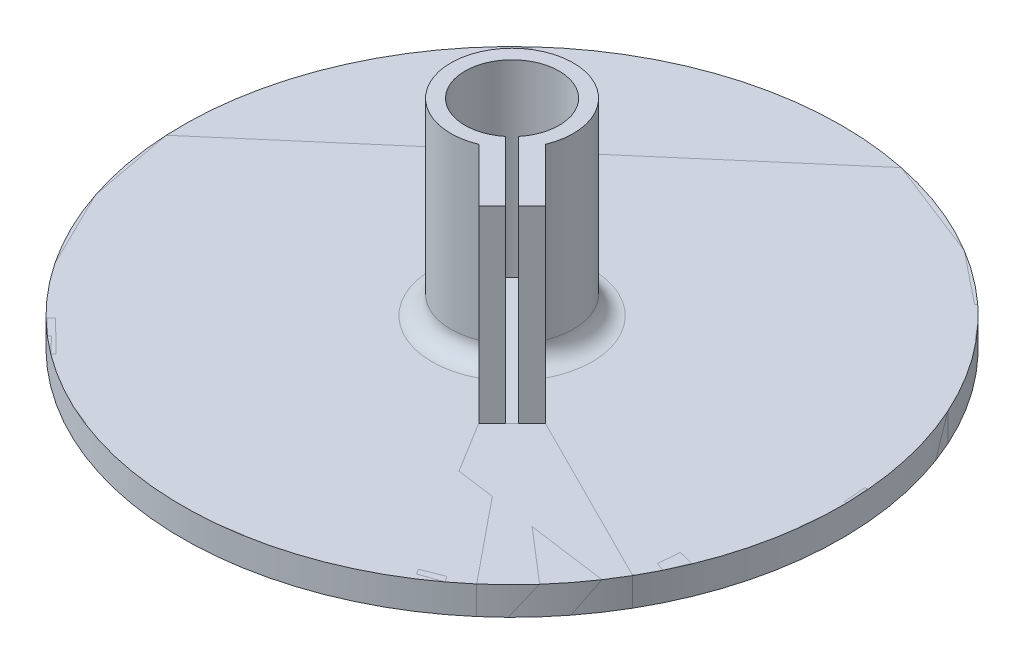
ISO-10303-21;
HEADER;
FILE_DESCRIPTION(('STEP AP214'),'2;1');
FILE_NAME('part.step','',(''),(''),'','','');
FILE_SCHEMA(('AUTOMOTIVE_DESIGN { 1 0 10303 214 1 1 1 1 }'));
ENDSEC;
DATA;
#1=APPLICATION_CONTEXT('core data for automotive mechanical design processes');
#2=APPLICATION_PROTOCOL_DEFINITION('international standard','automotive_design',2000,#1);
#3=PRODUCT_CONTEXT('',#1,'mechanical');
#4=PRODUCT('Part','Part','',(#3));
#5=PRODUCT_RELATED_PRODUCT_CATEGORY('part','',(#4));
#6=PRODUCT_DEFINITION_FORMATION('','',#4);
#7=PRODUCT_DEFINITION_CONTEXT('part definition',#1,'design');
#8=PRODUCT_DEFINITION('design','',#6,#7);
#9=PRODUCT_DEFINITION_SHAPE('','',#8);
#10=(LENGTH_UNIT() NAMED_UNIT(*) SI_UNIT(.MILLI.,.METRE.));
#11=(NAMED_UNIT(*) PLANE_ANGLE_UNIT() SI_UNIT($,.RADIAN.));
#12=(NAMED_UNIT(*) SI_UNIT($,.STERADIAN.) SOLID_ANGLE_UNIT());
#13=UNCERTAINTY_MEASURE_WITH_UNIT(LENGTH_MEASURE(1.E-05),#10,'distance_accuracy_value','');
#14=(GEOMETRIC_REPRESENTATION_CONTEXT(3) GLOBAL_UNCERTAINTY_ASSIGNED_CONTEXT((#13)) GLOBAL_UNIT_ASSIGNED_CONTEXT((#10,
#11,#12)) REPRESENTATION_CONTEXT('',''));
#15=CARTESIAN_POINT('',(0.,0.,0.));
#16=DIRECTION('',(0.,0.,1.));
#17=DIRECTION('',(1.,0.,0.));
#18=AXIS2_PLACEMENT_3D('',#15,#16,#17);
#19=CARTESIAN_POINT('',(4.9497474683059,11.5,4.94974746830577));
#20=DIRECTION('',(-0.707106781186557,0.,-0.707106781186538));
#21=DIRECTION('',(-0.707106781186538,0.,0.707106781186557));
#22=AXIS2_PLACEMENT_3D('',#19,#20,#21);
#23=PLANE('',#22);
#24=DIRECTION('',(0.,1.,0.));
#25=VECTOR('',#24,1.);
#26=CARTESIAN_POINT('',(5.12652416360251,11.5,4.77297077300915));
#27=LINE('',#26,#25);
#28=CARTESIAN_POINT('',(5.12652416360252,1.5,4.77297077300914));
#29=VERTEX_POINT('',#28);
#30=CARTESIAN_POINT('',(5.12652416360251,11.5,4.77297077300915));
#31=VERTEX_POINT('',#30);
#32=EDGE_CURVE('P0_E139',#29,#31,#27,.T.);
#33=ORIENTED_EDGE('',*,*,#32,.F.);
#34=DIRECTION('',(-0.707106781186538,0.,0.707106781186557));
#35=VECTOR('',#34,1.);
#36=CARTESIAN_POINT('',(4.9497474683059,1.5,4.94974746830577));
#37=LINE('',#36,#35);
#38=CARTESIAN_POINT('',(5.83363094478907,1.5,4.06586399182257));
#39=VERTEX_POINT('',#38);
#40=EDGE_CURVE('P0_E142',#39,#29,#37,.T.);
#41=ORIENTED_EDGE('',*,*,#40,.F.);
#42=DIRECTION('',(0.,1.,0.));
#43=VECTOR('',#42,1.);
#44=CARTESIAN_POINT('',(5.83363094478907,11.5,4.06586399182257));
#45=LINE('',#44,#43);
#46=CARTESIAN_POINT('',(5.83363094478907,11.5,4.06586399182257));
#47=VERTEX_POINT('',#46);
#48=EDGE_CURVE('P0_E136',#39,#47,#45,.T.);
#49=ORIENTED_EDGE('',*,*,#48,.T.);
#50=DIRECTION('',(0.707106781186537,0.,-0.707106781186558));
#51=VECTOR('',#50,1.);
#52=CARTESIAN_POINT('',(5.12652416360251,11.5,4.77297077300915));
#53=LINE('',#52,#51);
#54=EDGE_CURVE('P0_E121',#31,#47,#53,.T.);
#55=ORIENTED_EDGE('',*,*,#54,.F.);
#56=EDGE_LOOP('',(#33,#41,#49,#55));
#57=FACE_BOUND('',#56,.T.);
#58=ADVANCED_FACE('P0_F43',(#57),#23,.F.);
#59=CARTESIAN_POINT('',(4.94974746830591,11.5,4.94974746830576));
#60=DIRECTION('',(0.707106781186558,0.,0.707106781186537));
#61=DIRECTION('',(0.707106781186537,0.,-0.707106781186558));
#62=AXIS2_PLACEMENT_3D('',#59,#60,#61);
#63=PLANE('',#62);
#64=DIRECTION('',(0.707106781186536,0.,-0.707106781186559));
#65=VECTOR('',#64,1.);
#66=CARTESIAN_POINT('',(4.06586399182272,11.5,5.83363094478897));
#67=LINE('',#66,#65);
#68=CARTESIAN_POINT('',(4.06586399182273,11.5,5.83363094478897));
#69=VERTEX_POINT('',#68);
#70=CARTESIAN_POINT('',(4.77297077300926,11.5,5.12652416360241));
#71=VERTEX_POINT('',#70);
#72=EDGE_CURVE('P0_E132',#69,#71,#67,.T.);
#73=ORIENTED_EDGE('',*,*,#72,.F.);
#74=DIRECTION('',(0.,1.,0.));
#75=VECTOR('',#74,1.);
#76=CARTESIAN_POINT('',(4.06586399182272,11.5,5.83363094478897));
#77=LINE('',#76,#75);
#78=CARTESIAN_POINT('',(4.06586399182272,1.5,5.83363094478897));
#79=VERTEX_POINT('',#78);
#80=EDGE_CURVE('P0_E185',#79,#69,#77,.T.);
#81=ORIENTED_EDGE('',*,*,#80,.F.);
#82=DIRECTION('',(0.707106781186537,0.,-0.707106781186558));
#83=VECTOR('',#82,1.);
#84=CARTESIAN_POINT('',(4.94974746830591,1.49999999999999,4.94974746830576));
#85=LINE('',#84,#83);
#86=CARTESIAN_POINT('',(4.77297077300926,1.5,5.12652416360241));
#87=VERTEX_POINT('',#86);
#88=EDGE_CURVE('P0_E292',#79,#87,#85,.T.);
#89=ORIENTED_EDGE('',*,*,#88,.T.);
#90=DIRECTION('',(0.,1.,0.));
#91=VECTOR('',#90,1.);
#92=CARTESIAN_POINT('',(4.77297077300926,11.5,5.12652416360241));
#93=LINE('',#92,#91);
#94=EDGE_CURVE('P0_E174',#87,#71,#93,.T.);
#95=ORIENTED_EDGE('',*,*,#94,.T.);
#96=EDGE_LOOP('',(#73,#81,#89,#95));
#97=FACE_BOUND('',#96,.T.);
#98=ADVANCED_FACE('P0_F223',(#97),#63,.T.);
#99=CARTESIAN_POINT('',(0.,11.5,0.));
#100=DIRECTION('',(0.,1.,0.));
#101=DIRECTION('',(0.,0.,1.));
#102=AXIS2_PLACEMENT_3D('',#99,#100,#101);
#103=PLANE('',#102);
#104=CARTESIAN_POINT('',(0.,11.5,0.));
#105=DIRECTION('',(0.,-1.,0.));
#106=DIRECTION('',(0.,0.,-1.));
#107=AXIS2_PLACEMENT_3D('',#104,#105,#106);
#108=CIRCLE('',#107,3.25);
#109=CARTESIAN_POINT('',(1.2374368670765,11.5,3.00520382004281));
#110=VERTEX_POINT('',#109);
#111=CARTESIAN_POINT('',(3.00520382004285,11.5,1.23743686707642));
#112=VERTEX_POINT('',#111);
#113=EDGE_CURVE('P0_E131',#110,#112,#108,.T.);
#114=ORIENTED_EDGE('',*,*,#113,.F.);
#115=DIRECTION('',(0.707106781186557,0.,0.707106781186538));
#116=VECTOR('',#115,1.);
#117=CARTESIAN_POINT('',(-0.883883476483175,11.5,0.883883476483198));
#118=LINE('',#117,#116);
#119=EDGE_CURVE('P0_E152',#69,#110,#118,.F.);
#120=ORIENTED_EDGE('',*,*,#119,.F.);
#121=ORIENTED_EDGE('',*,*,#72,.T.);
#122=DIRECTION('',(0.707106781186557,0.,0.707106781186538));
#123=VECTOR('',#122,1.);
#124=CARTESIAN_POINT('',(-0.176776695296636,11.5,0.176776695296641));
#125=LINE('',#124,#123);
#126=CARTESIAN_POINT('',(1.58212921463717,11.5,1.9356826052304));
#127=VERTEX_POINT('',#126);
#128=EDGE_CURVE('P0_E178',#71,#127,#125,.F.);
#129=ORIENTED_EDGE('',*,*,#128,.T.);
#130=CARTESIAN_POINT('',(0.,11.5,0.));
#131=DIRECTION('',(0.,-1.,0.));
#132=DIRECTION('',(0.,0.,-1.));
#133=AXIS2_PLACEMENT_3D('',#130,#131,#132);
#134=CIRCLE('',#133,2.5);
#135=CARTESIAN_POINT('',(1.93568260523045,11.5,1.58212921463712));
#136=VERTEX_POINT('',#135);
#137=EDGE_CURVE('P0_E171',#127,#136,#134,.T.);
#138=ORIENTED_EDGE('',*,*,#137,.T.);
#139=DIRECTION('',(0.707106781186551,0.,0.707106781186544));
#140=VECTOR('',#139,1.);
#141=CARTESIAN_POINT('',(0.176776695296654,11.5,-0.176776695296656));
#142=LINE('',#141,#140);
#143=EDGE_CURVE('P0_E126',#31,#136,#142,.F.);
#144=ORIENTED_EDGE('',*,*,#143,.F.);
#145=ORIENTED_EDGE('',*,*,#54,.T.);
#146=DIRECTION('',(0.707106781186556,0.,0.707106781186539));
#147=VECTOR('',#146,1.);
#148=CARTESIAN_POINT('',(0.883883476483177,11.5,-0.883883476483198));
#149=LINE('',#148,#147);
#150=EDGE_CURVE('P0_E124',#47,#112,#149,.F.);
#151=ORIENTED_EDGE('',*,*,#150,.T.);
#152=EDGE_LOOP('',(#114,#120,#121,#129,#138,#144,#145,#151));
#153=FACE_BOUND('',#152,.T.);
#154=ADVANCED_FACE('P0_F123',(#153),#103,.T.);
#155=CARTESIAN_POINT('',(0.,11.5,0.));
#156=DIRECTION('',(0.,-1.,0.));
#157=DIRECTION('',(0.,0.,-1.));
#158=AXIS2_PLACEMENT_3D('',#155,#156,#157);
#159=CYLINDRICAL_SURFACE('',#158,3.25);
#160=DIRECTION('',(0.,1.,0.));
#161=VECTOR('',#160,1.);
#162=CARTESIAN_POINT('',(3.00520382004284,11.5,1.23743686707642));
#163=LINE('',#162,#161);
#164=CARTESIAN_POINT('',(3.00520382004284,2.5,1.23743686707642));
#165=VERTEX_POINT('',#164);
#166=EDGE_CURVE('P0_E137',#112,#165,#163,.F.);
#167=ORIENTED_EDGE('',*,*,#166,.T.);
#168=CARTESIAN_POINT('',(0.,2.5,0.));
#169=DIRECTION('',(0.,1.,0.));
#170=DIRECTION('',(0.,0.,1.));
#171=AXIS2_PLACEMENT_3D('',#168,#169,#170);
#172=CIRCLE('',#171,3.25);
#173=CARTESIAN_POINT('',(1.2374368670765,2.5,3.00520382004281));
#174=VERTEX_POINT('',#173);
#175=EDGE_CURVE('P0_E57',#165,#174,#172,.T.);
#176=ORIENTED_EDGE('',*,*,#175,.T.);
#177=DIRECTION('',(0.,1.,0.));
#178=VECTOR('',#177,1.);
#179=CARTESIAN_POINT('',(1.2374368670765,11.5,3.00520382004281));
#180=LINE('',#179,#178);
#181=EDGE_CURVE('P0_E188',#110,#174,#180,.F.);
#182=ORIENTED_EDGE('',*,*,#181,.F.);
#183=ORIENTED_EDGE('',*,*,#113,.T.);
#184=EDGE_LOOP('',(#167,#176,#182,#183));
#185=FACE_BOUND('',#184,.T.);
#186=ADVANCED_FACE('P0_F216',(#185),#159,.T.);
#187=CARTESIAN_POINT('',(0.883883476483177,11.5,-0.883883476483198));
#188=DIRECTION('',(-0.707106781186539,0.,0.707106781186556));
#189=DIRECTION('',(0.707106781186556,0.,0.707106781186539));
#190=AXIS2_PLACEMENT_3D('',#187,#188,#189);
#191=PLANE('',#190);
#192=CARTESIAN_POINT('',(4.37547034870921,6.30693793995764,2.60770339574275));
#193=DIRECTION('',(-0.707106781186539,0.,0.707106781186556));
#194=DIRECTION('',(0.707106781186556,0.,0.707106781186539));
#195=AXIS2_PLACEMENT_3D('',#192,#193,#194);
#196=CIRCLE('',#195,0.999999999999999);
#197=CARTESIAN_POINT('',(5.08257712989577,6.30693793995764,3.31481017692929));
#198=VERTEX_POINT('',#197);
#199=EDGE_CURVE('P0_E293',#198,#198,#196,.T.);
#200=ORIENTED_EDGE('',*,*,#199,.T.);
#201=EDGE_LOOP('',(#200));
#202=FACE_BOUND('',#201,.T.);
#203=DIRECTION('',(0.707106781186556,0.,0.707106781186539));
#204=VECTOR('',#203,1.);
#205=CARTESIAN_POINT('',(3.00520382004284,1.5,1.23743686707642));
#206=LINE('',#205,#204);
#207=CARTESIAN_POINT('',(3.75616479975223,1.5,1.98839784678578));
#208=VERTEX_POINT('',#207);
#209=EDGE_CURVE('P0_E191',#208,#39,#206,.T.);
#210=ORIENTED_EDGE('',*,*,#209,.F.);
#211=CARTESIAN_POINT('',(3.75616479975223,1.5,1.98839784678578));
#212=CARTESIAN_POINT('',(3.71235481496573,1.49996434340354,1.94458786199929));
#213=CARTESIAN_POINT('',(3.66856007215664,1.50525791034755,1.9007931191902));
#214=CARTESIAN_POINT('',(3.58220986541938,1.52610742433583,1.81444291245294));
#215=CARTESIAN_POINT('',(3.53965433452256,1.5416628157389,1.77188738155612));
#216=CARTESIAN_POINT('',(3.45697142020611,1.5826473896517,1.68920446723968));
#217=CARTESIAN_POINT('',(3.41684491886813,1.60808013447064,1.64907796590169));
#218=CARTESIAN_POINT('',(3.34021721265806,1.66818742125207,1.57245025969163));
#219=CARTESIAN_POINT('',(3.30371531986759,1.70286020491827,1.53594836690116));
#220=CARTESIAN_POINT('',(3.23583345910834,1.78026052414193,1.46806650614191));
#221=CARTESIAN_POINT('',(3.20440748961424,1.82290715367659,1.43664053664781));
#222=CARTESIAN_POINT('',(3.14739787541136,1.91544003750141,1.37963092244493));
#223=CARTESIAN_POINT('',(3.12181400853563,1.96532601637126,1.3540470555692));
#224=CARTESIAN_POINT('',(3.07877173768836,2.06813016401641,1.31100478472194));
#225=CARTESIAN_POINT('',(3.06095505300264,2.12074827043324,1.29318810003621));
#226=CARTESIAN_POINT('',(3.03239844974008,2.22965373572821,1.26463149677365));
#227=CARTESIAN_POINT('',(3.02164590251538,2.28593434797145,1.25387894954896));
#228=CARTESIAN_POINT('',(3.0115366843966,2.36899565685474,1.24376973143017));
#229=CARTESIAN_POINT('',(3.00916343219829,2.39509956733447,1.24139647923186));
#230=CARTESIAN_POINT('',(3.00599795119211,2.44746404296182,1.23823099822568));
#231=CARTESIAN_POINT('',(3.00520366570885,2.47372435957889,1.23743671274242));
#232=CARTESIAN_POINT('',(3.00520382004286,2.5,1.23743686707643));
#233=B_SPLINE_CURVE_WITH_KNOTS('',3,(#211,#212,#213,#214,#215,#216,#217,#218,#219,#220,#221,
#222,#223,#224,#225,#226,#227,#228,#229,#230,#231,#232),.UNSPECIFIED.,.F.,.F.,(4,2,2,2,2,2,2,2,
2,2,4),(0.,0.185615987238133,0.371221924857289,0.556894864296959,0.742532497043705,
0.926379815069965,1.11022014047648,1.28433402762256,1.4581357959966,1.53701141278667,
1.61578422303188),.UNSPECIFIED.);
#234=EDGE_CURVE('P0_E71',#208,#165,#233,.T.);
#235=ORIENTED_EDGE('',*,*,#234,.T.);
#236=ORIENTED_EDGE('',*,*,#166,.F.);
#237=ORIENTED_EDGE('',*,*,#150,.F.);
#238=ORIENTED_EDGE('',*,*,#48,.F.);
#239=EDGE_LOOP('',(#210,#235,#236,#237,#238));
#240=FACE_BOUND('',#239,.T.);
#241=ADVANCED_FACE('P0_F135',(#202,#240),#191,.F.);
#242=CARTESIAN_POINT('',(0.176776695296654,11.5,-0.176776695296656));
#243=DIRECTION('',(-0.707106781186544,0.,0.707106781186551));
#244=DIRECTION('',(0.707106781186551,0.,0.707106781186544));
#245=AXIS2_PLACEMENT_3D('',#242,#243,#244);
#246=PLANE('',#245);
#247=CARTESIAN_POINT('',(3.66836356752267,6.30693793995764,3.31481017692932));
#248=DIRECTION('',(-0.707106781186544,0.,0.707106781186551));
#249=DIRECTION('',(0.707106781186551,0.,0.707106781186544));
#250=AXIS2_PLACEMENT_3D('',#247,#248,#249);
#251=CIRCLE('',#250,0.999999999999999);
#252=CARTESIAN_POINT('',(4.37547034870922,6.30693793995764,4.02191695811586));
#253=VERTEX_POINT('',#252);
#254=EDGE_CURVE('P0_E467',#253,#253,#251,.T.);
#255=ORIENTED_EDGE('',*,*,#254,.F.);
#256=EDGE_LOOP('',(#255));
#257=FACE_BOUND('',#256,.T.);
#258=ORIENTED_EDGE('',*,*,#143,.T.);
#259=DIRECTION('',(0.,-1.,0.));
#260=VECTOR('',#259,1.);
#261=CARTESIAN_POINT('',(1.93568260523045,11.5,1.58212921463712));
#262=LINE('',#261,#260);
#263=CARTESIAN_POINT('',(1.93568260523045,1.5,1.58212921463712));
#264=VERTEX_POINT('',#263);
#265=EDGE_CURVE('P0_E167',#136,#264,#262,.T.);
#266=ORIENTED_EDGE('',*,*,#265,.T.);
#267=DIRECTION('',(-0.707106781186553,0.,-0.707106781186542));
#268=VECTOR('',#267,1.);
#269=CARTESIAN_POINT('',(5.12652416360252,1.5,4.77297077300914));
#270=LINE('',#269,#268);
#271=EDGE_CURVE('P0_E199',#29,#264,#270,.T.);
#272=ORIENTED_EDGE('',*,*,#271,.F.);
#273=ORIENTED_EDGE('',*,*,#32,.T.);
#274=EDGE_LOOP('',(#258,#266,#272,#273));
#275=FACE_BOUND('',#274,.T.);
#276=ADVANCED_FACE('P0_F215',(#257,#275),#246,.T.);
#277=CARTESIAN_POINT('',(0.,11.5,0.));
#278=DIRECTION('',(0.,-1.,0.));
#279=DIRECTION('',(0.,0.,-1.));
#280=AXIS2_PLACEMENT_3D('',#277,#278,#279);
#281=CYLINDRICAL_SURFACE('',#280,2.5);
#282=ORIENTED_EDGE('',*,*,#137,.F.);
#283=DIRECTION('',(0.,1.,0.));
#284=VECTOR('',#283,1.);
#285=CARTESIAN_POINT('',(1.58212921463717,11.5,1.9356826052304));
#286=LINE('',#285,#284);
#287=CARTESIAN_POINT('',(1.58212921463717,1.5,1.9356826052304));
#288=VERTEX_POINT('',#287);
#289=EDGE_CURVE('P0_E179',#127,#288,#286,.F.);
#290=ORIENTED_EDGE('',*,*,#289,.T.);
#291=CARTESIAN_POINT('',(0.,1.5,0.));
#292=DIRECTION('',(0.,-1.,0.));
#293=DIRECTION('',(0.,0.,-1.));
#294=AXIS2_PLACEMENT_3D('',#291,#292,#293);
#295=CIRCLE('',#294,2.5);
#296=EDGE_CURVE('P0_E307',#264,#288,#295,.F.);
#297=ORIENTED_EDGE('',*,*,#296,.F.);
#298=ORIENTED_EDGE('',*,*,#265,.F.);
#299=EDGE_LOOP('',(#282,#290,#297,#298));
#300=FACE_BOUND('',#299,.T.);
#301=ADVANCED_FACE('P0_F256',(#300),#281,.F.);
#302=CARTESIAN_POINT('',(-0.176776695296636,11.5,0.176776695296641));
#303=DIRECTION('',(-0.707106781186538,0.,0.707106781186557));
#304=DIRECTION('',(0.707106781186557,0.,0.707106781186538));
#305=AXIS2_PLACEMENT_3D('',#302,#303,#304);
#306=PLANE('',#305);
#307=CARTESIAN_POINT('',(3.3148101769294,6.30693793995764,3.66836356752259));
#308=DIRECTION('',(-0.707106781186538,0.,0.707106781186557));
#309=DIRECTION('',(0.707106781186557,0.,0.707106781186538));
#310=AXIS2_PLACEMENT_3D('',#307,#308,#309);
#311=CIRCLE('',#310,0.999999999999999);
#312=CARTESIAN_POINT('',(4.02191695811596,6.30693793995764,4.37547034870913));
#313=VERTEX_POINT('',#312);
#314=EDGE_CURVE('P0_E471',#313,#313,#311,.T.);
#315=ORIENTED_EDGE('',*,*,#314,.T.);
#316=EDGE_LOOP('',(#315));
#317=FACE_BOUND('',#316,.T.);
#318=ORIENTED_EDGE('',*,*,#94,.F.);
#319=DIRECTION('',(0.707106781186557,0.,0.707106781186538));
#320=VECTOR('',#319,1.);
#321=CARTESIAN_POINT('',(1.58212921463717,1.5,1.9356826052304));
#322=LINE('',#321,#320);
#323=EDGE_CURVE('P0_E273',#288,#87,#322,.T.);
#324=ORIENTED_EDGE('',*,*,#323,.F.);
#325=ORIENTED_EDGE('',*,*,#289,.F.);
#326=ORIENTED_EDGE('',*,*,#128,.F.);
#327=EDGE_LOOP('',(#318,#324,#325,#326));
#328=FACE_BOUND('',#327,.T.);
#329=ADVANCED_FACE('P0_F253',(#317,#328),#306,.F.);
#330=CARTESIAN_POINT('',(-0.883883476483175,11.5,0.883883476483198));
#331=DIRECTION('',(-0.707106781186538,0.,0.707106781186557));
#332=DIRECTION('',(0.707106781186557,0.,0.707106781186538));
#333=AXIS2_PLACEMENT_3D('',#330,#331,#332);
#334=PLANE('',#333);
#335=CARTESIAN_POINT('',(2.60770339574286,6.30693793995764,4.37547034870915));
#336=DIRECTION('',(-0.707106781186538,0.,0.707106781186557));
#337=DIRECTION('',(0.707106781186557,0.,0.707106781186538));
#338=AXIS2_PLACEMENT_3D('',#335,#336,#337);
#339=CIRCLE('',#338,0.999999999999999);
#340=CARTESIAN_POINT('',(3.31481017692942,6.30693793995764,5.08257712989568));
#341=VERTEX_POINT('',#340);
#342=EDGE_CURVE('P0_E480',#341,#341,#339,.T.);
#343=ORIENTED_EDGE('',*,*,#342,.F.);
#344=EDGE_LOOP('',(#343));
#345=FACE_BOUND('',#344,.T.);
#346=ORIENTED_EDGE('',*,*,#181,.T.);
#347=CARTESIAN_POINT('',(1.2374368670765,2.5,3.00520382004281));
#348=CARTESIAN_POINT('',(1.23743592225773,2.47328658773908,3.00520287522404));
#349=CARTESIAN_POINT('',(1.2382574214273,2.44658675258182,3.00602437439362));
#350=CARTESIAN_POINT('',(1.24152756927432,2.39339372650545,3.00929452224064));
#351=CARTESIAN_POINT('',(1.24397581024609,2.36690048549107,3.01174276321241));
#352=CARTESIAN_POINT('',(1.25370857195432,2.28819072583843,3.02147552492064));
#353=CARTESIAN_POINT('',(1.26338145692694,2.23652710367601,3.03114840989325));
#354=CARTESIAN_POINT('',(1.28867447025181,2.136273956589,3.05644142321813));
#355=CARTESIAN_POINT('',(1.30429168580219,2.08768293962392,3.0720586387685));
#356=CARTESIAN_POINT('',(1.34087094348211,1.99468393538098,3.10863789644842));
#357=CARTESIAN_POINT('',(1.3618360008399,1.95027832733394,3.12960295380622));
#358=CARTESIAN_POINT('',(1.40927501030763,1.8650708055186,3.17704196327394));
#359=CARTESIAN_POINT('',(1.43592620788518,1.82446672948126,3.20369316085149));
#360=CARTESIAN_POINT('',(1.49339116596947,1.74965413816192,3.26115811893578));
#361=CARTESIAN_POINT('',(1.52420623282895,1.71544763808739,3.29197318579526));
#362=CARTESIAN_POINT('',(1.59141623347916,1.6519615565192,3.35918318644547));
#363=CARTESIAN_POINT('',(1.62804976021061,1.62318692924783,3.39581671317692));
#364=CARTESIAN_POINT('',(1.70410525335884,1.5743257738979,3.47187220632514));
#365=CARTESIAN_POINT('',(1.74352709542095,1.55423885864442,3.51129404838725));
#366=CARTESIAN_POINT('',(1.8171298103882,1.52590928168508,3.5848967633545));
#367=CARTESIAN_POINT('',(1.85103588387719,1.51621779675563,3.61880283684349));
#368=CARTESIAN_POINT('',(1.91942301797947,1.5032606001753,3.68718997094577));
#369=CARTESIAN_POINT('',(1.95390350430202,1.49998881831728,3.72167045726832));
#370=CARTESIAN_POINT('',(1.98839784678588,1.5,3.75616479975218));
#371=B_SPLINE_CURVE_WITH_KNOTS('',3,(#347,#348,#349,#350,#351,#352,#353,#354,#355,#356,#357,
#358,#359,#360,#361,#362,#363,#364,#365,#366,#367,#368,#369,#370),.UNSPECIFIED.,.F.,.F.,(4,2,2,
2,2,2,2,2,2,2,2,4),(0.,0.0800884336684891,0.160156802567894,0.319651033829966,0.479067211180306,
0.638573470241008,0.804067051051379,0.969612674115091,1.14661763258664,1.32361470187553,
1.46995694323153,1.61616074257357),.UNSPECIFIED.);
#372=CARTESIAN_POINT('',(1.98839784678588,1.5,3.75616479975218));
#373=VERTEX_POINT('',#372);
#374=EDGE_CURVE('P0_E12',#174,#373,#371,.T.);
#375=ORIENTED_EDGE('',*,*,#374,.T.);
#376=DIRECTION('',(-0.707106781186557,0.,-0.707106781186538));
#377=VECTOR('',#376,1.);
#378=CARTESIAN_POINT('',(4.06586399182272,1.5,5.83363094478897));
#379=LINE('',#378,#377);
#380=EDGE_CURVE('P0_E306',#79,#373,#379,.T.);
#381=ORIENTED_EDGE('',*,*,#380,.F.);
#382=ORIENTED_EDGE('',*,*,#80,.T.);
#383=ORIENTED_EDGE('',*,*,#119,.T.);
#384=EDGE_LOOP('',(#346,#375,#381,#382,#383));
#385=FACE_BOUND('',#384,.T.);
#386=ADVANCED_FACE('P0_F248',(#345,#385),#334,.T.);
#387=CARTESIAN_POINT('',(0.,1.5,0.));
#388=DIRECTION('',(0.,1.,0.));
#389=DIRECTION('',(0.,0.,1.));
#390=AXIS2_PLACEMENT_3D('',#387,#388,#389);
#391=PLANE('',#390);
#392=CARTESIAN_POINT('',(0.,1.5,0.));
#393=DIRECTION('',(0.,-1.,0.));
#394=DIRECTION('',(0.,0.,-1.));
#395=AXIS2_PLACEMENT_3D('',#392,#393,#394);
#396=CIRCLE('',#395,17.5);
#397=CARTESIAN_POINT('',(0.,1.5,-17.5));
#398=VERTEX_POINT('',#397);
#399=EDGE_CURVE('P0_E301',#398,#398,#396,.T.);
#400=ORIENTED_EDGE('',*,*,#399,.F.);
#401=EDGE_LOOP('',(#400));
#402=FACE_BOUND('',#401,.T.);
#403=ORIENTED_EDGE('',*,*,#380,.T.);
#404=CARTESIAN_POINT('',(0.,1.5,0.));
#405=DIRECTION('',(0.,1.,0.));
#406=DIRECTION('',(0.,0.,1.));
#407=AXIS2_PLACEMENT_3D('',#404,#405,#406);
#408=CIRCLE('',#407,4.25);
#409=EDGE_CURVE('P0_E202',#373,#208,#408,.F.);
#410=ORIENTED_EDGE('',*,*,#409,.T.);
#411=ORIENTED_EDGE('',*,*,#209,.T.);
#412=ORIENTED_EDGE('',*,*,#40,.T.);
#413=ORIENTED_EDGE('',*,*,#271,.T.);
#414=ORIENTED_EDGE('',*,*,#296,.T.);
#415=ORIENTED_EDGE('',*,*,#323,.T.);
#416=ORIENTED_EDGE('',*,*,#88,.F.);
#417=EDGE_LOOP('',(#403,#410,#411,#412,#413,#414,#415,#416));
#418=FACE_BOUND('',#417,.T.);
#419=ADVANCED_FACE('P0_F242',(#402,#418),#391,.T.);
#420=CARTESIAN_POINT('',(0.,1.5,0.));
#421=DIRECTION('',(0.,-1.,0.));
#422=DIRECTION('',(0.,0.,-1.));
#423=AXIS2_PLACEMENT_3D('',#420,#421,#422);
#424=CYLINDRICAL_SURFACE('',#423,17.5);
#425=ORIENTED_EDGE('',*,*,#399,.T.);
#426=EDGE_LOOP('',(#425));
#427=FACE_BOUND('',#426,.T.);
#428=CARTESIAN_POINT('',(0.,0.,0.));
#429=DIRECTION('',(0.,-1.,0.));
#430=DIRECTION('',(0.,0.,-1.));
#431=AXIS2_PLACEMENT_3D('',#428,#429,#430);
#432=CIRCLE('',#431,17.5);
#433=CARTESIAN_POINT('',(0.,0.,-17.5));
#434=VERTEX_POINT('',#433);
#435=EDGE_CURVE('P0_E205',#434,#434,#432,.F.);
#436=ORIENTED_EDGE('',*,*,#435,.T.);
#437=EDGE_LOOP('',(#436));
#438=FACE_BOUND('',#437,.T.);
#439=ADVANCED_FACE('P0_F236',(#427,#438),#424,.T.);
#440=CARTESIAN_POINT('',(0.,0.,0.));
#441=DIRECTION('',(0.,1.,0.));
#442=DIRECTION('',(0.,0.,1.));
#443=AXIS2_PLACEMENT_3D('',#440,#441,#442);
#444=PLANE('',#443);
#445=ORIENTED_EDGE('',*,*,#435,.F.);
#446=EDGE_LOOP('',(#445));
#447=FACE_BOUND('',#446,.T.);
#448=ADVANCED_FACE('P0_F232',(#447),#444,.F.);
#449=CARTESIAN_POINT('',(20.9915868722258,6.30693793995764,-14.0084131277743));
#450=DIRECTION('',(-0.707106781186538,0.,0.707106781186557));
#451=DIRECTION('',(0.707106781186557,0.,0.707106781186538));
#452=AXIS2_PLACEMENT_3D('',#449,#450,#451);
#453=CYLINDRICAL_SURFACE('',#452,0.999999999999999);
#454=ORIENTED_EDGE('',*,*,#342,.T.);
#455=EDGE_LOOP('',(#454));
#456=FACE_BOUND('',#455,.T.);
#457=ORIENTED_EDGE('',*,*,#314,.F.);
#458=EDGE_LOOP('',(#457));
#459=FACE_BOUND('',#458,.T.);
#460=ADVANCED_FACE('P0_F227',(#456,#459),#453,.F.);
#461=ORIENTED_EDGE('',*,*,#254,.T.);
#462=EDGE_LOOP('',(#461));
#463=FACE_BOUND('',#462,.T.);
#464=ORIENTED_EDGE('',*,*,#199,.F.);
#465=EDGE_LOOP('',(#464));
#466=FACE_BOUND('',#465,.T.);
#467=ADVANCED_FACE('P0_F231',(#463,#466),#453,.F.);
#468=CARTESIAN_POINT('',(0.,2.5,0.));
#469=DIRECTION('',(0.,1.,0.));
#470=DIRECTION('',(0.,0.,1.));
#471=AXIS2_PLACEMENT_3D('',#468,#469,#470);
#472=TOROIDAL_SURFACE('',#471,4.25,1.);
#473=ORIENTED_EDGE('',*,*,#374,.F.);
#474=ORIENTED_EDGE('',*,*,#175,.F.);
#475=ORIENTED_EDGE('',*,*,#234,.F.);
#476=ORIENTED_EDGE('',*,*,#409,.F.);
#477=EDGE_LOOP('',(#473,#474,#475,#476));
#478=FACE_BOUND('',#477,.T.);
#479=ADVANCED_FACE('P0_F45',(#478),#472,.F.);
#480=CLOSED_SHELL('',(#58,#98,#154,#186,#241,#276,#301,#329,#386,#419,#439,#448,#460,#467,#479));
#481=MANIFOLD_SOLID_BREP('P0_B2',#480);
#482=CARTESIAN_POINT('',(0.,1.5,0.));
#483=DIRECTION('',(0.,1.,0.));
#484=DIRECTION('',(0.,0.,1.));
#485=AXIS2_PLACEMENT_3D('',#482,#483,#484);
#486=PLANE('',#485);
#487=CARTESIAN_POINT('',(0.,1.5,0.));
#488=DIRECTION('',(0.,-1.,0.));
#489=DIRECTION('',(0.,0.,-1.));
#490=AXIS2_PLACEMENT_3D('',#487,#488,#489);
#491=CIRCLE('',#490,17.5);
#492=CARTESIAN_POINT('',(0.,1.5,-17.5));
#493=VERTEX_POINT('',#492);
#494=EDGE_CURVE('P1_E19',#493,#493,#491,.T.);
#495=ORIENTED_EDGE('',*,*,#494,.F.);
#496=EDGE_LOOP('',(#495));
#497=FACE_BOUND('',#496,.T.);
#498=ADVANCED_FACE('P1_F16',(#497),#486,.T.);
#499=CARTESIAN_POINT('',(0.,1.5,0.));
#500=DIRECTION('',(0.,-1.,0.));
#501=DIRECTION('',(0.,0.,-1.));
#502=AXIS2_PLACEMENT_3D('',#499,#500,#501);
#503=CYLINDRICAL_SURFACE('',#502,17.5);
#504=ORIENTED_EDGE('',*,*,#494,.T.);
#505=EDGE_LOOP('',(#504));
#506=FACE_BOUND('',#505,.T.);
#507=CARTESIAN_POINT('',(0.,0.,0.));
#508=DIRECTION('',(0.,-1.,0.));
#509=DIRECTION('',(0.,0.,-1.));
#510=AXIS2_PLACEMENT_3D('',#507,#508,#509);
#511=CIRCLE('',#510,17.5);
#512=CARTESIAN_POINT('',(0.,0.,-17.5));
#513=VERTEX_POINT('',#512);
#514=EDGE_CURVE('P1_E11',#513,#513,#511,.F.);
#515=ORIENTED_EDGE('',*,*,#514,.T.);
#516=EDGE_LOOP('',(#515));
#517=FACE_BOUND('',#516,.T.);
#518=ADVANCED_FACE('P1_F35',(#506,#517),#503,.T.);
#519=CARTESIAN_POINT('',(0.,0.,0.));
#520=DIRECTION('',(0.,1.,0.));
#521=DIRECTION('',(0.,0.,1.));
#522=AXIS2_PLACEMENT_3D('',#519,#520,#521);
#523=PLANE('',#522);
#524=ORIENTED_EDGE('',*,*,#514,.F.);
#525=EDGE_LOOP('',(#524));
#526=FACE_BOUND('',#525,.T.);
#527=ADVANCED_FACE('P1_F42',(#526),#523,.F.);
#528=CLOSED_SHELL('',(#498,#518,#527));
#529=MANIFOLD_SOLID_BREP('P1_B1',#528);
#530=ADVANCED_BREP_SHAPE_REPRESENTATION('',(#18,#481,#529),#14);
#531=SHAPE_DEFINITION_REPRESENTATION(#9,#530);
ENDSEC;
END-ISO-10303-21;
